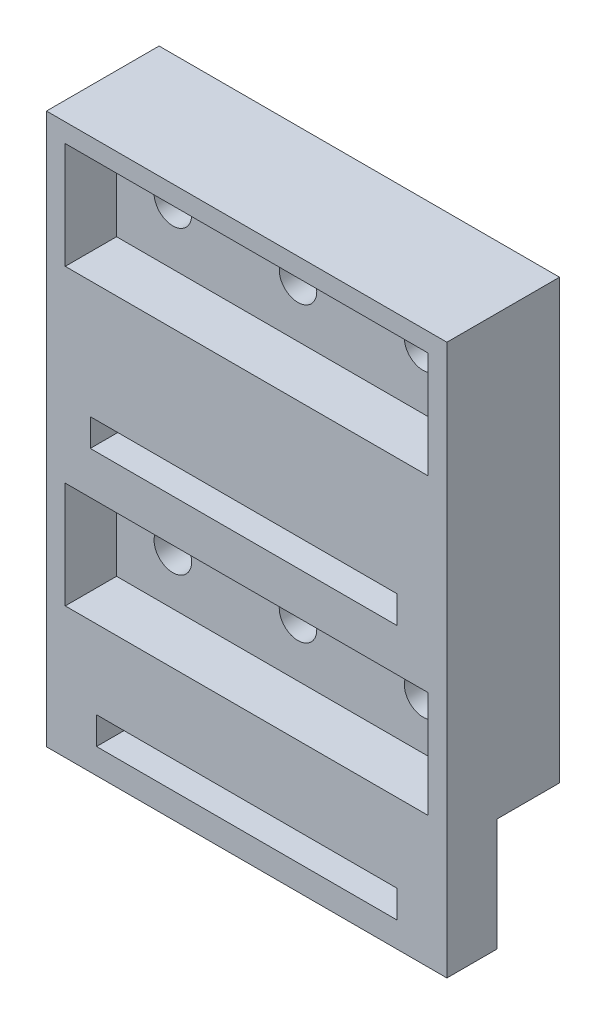
ISO-10303-21;
HEADER;
FILE_DESCRIPTION(('STEP AP214'),'2;1');
FILE_NAME('part.step','',(''),(''),'','','');
FILE_SCHEMA(('AUTOMOTIVE_DESIGN { 1 0 10303 214 1 1 1 1 }'));
ENDSEC;
DATA;
#1=APPLICATION_CONTEXT('core data for automotive mechanical design processes');
#2=APPLICATION_PROTOCOL_DEFINITION('international standard','automotive_design',2000,#1);
#3=PRODUCT_CONTEXT('',#1,'mechanical');
#4=PRODUCT('Part','Part','',(#3));
#5=PRODUCT_RELATED_PRODUCT_CATEGORY('part','',(#4));
#6=PRODUCT_DEFINITION_FORMATION('','',#4);
#7=PRODUCT_DEFINITION_CONTEXT('part definition',#1,'design');
#8=PRODUCT_DEFINITION('design','',#6,#7);
#9=PRODUCT_DEFINITION_SHAPE('','',#8);
#10=(LENGTH_UNIT() NAMED_UNIT(*) SI_UNIT(.MILLI.,.METRE.));
#11=(NAMED_UNIT(*) PLANE_ANGLE_UNIT() SI_UNIT($,.RADIAN.));
#12=(NAMED_UNIT(*) SI_UNIT($,.STERADIAN.) SOLID_ANGLE_UNIT());
#13=UNCERTAINTY_MEASURE_WITH_UNIT(LENGTH_MEASURE(1.E-05),#10,'distance_accuracy_value','');
#14=(GEOMETRIC_REPRESENTATION_CONTEXT(3) GLOBAL_UNCERTAINTY_ASSIGNED_CONTEXT((#13)) GLOBAL_UNIT_ASSIGNED_CONTEXT((#10,
#11,#12)) REPRESENTATION_CONTEXT('',''));
#15=CARTESIAN_POINT('',(0.,0.,0.));
#16=DIRECTION('',(0.,0.,1.));
#17=DIRECTION('',(1.,0.,0.));
#18=AXIS2_PLACEMENT_3D('',#15,#16,#17);
#19=CARTESIAN_POINT('',(-16.,-17.5,9.));
#20=DIRECTION('',(0.,1.,0.));
#21=DIRECTION('',(0.,0.,1.));
#22=AXIS2_PLACEMENT_3D('',#19,#20,#21);
#23=PLANE('',#22);
#24=DIRECTION('',(1.,0.,0.));
#25=VECTOR('',#24,1.);
#26=CARTESIAN_POINT('',(16.,-17.5,5.));
#27=LINE('',#26,#25);
#28=CARTESIAN_POINT('',(-16.,-17.5,5.));
#29=VERTEX_POINT('',#28);
#30=CARTESIAN_POINT('',(16.,-17.5,5.));
#31=VERTEX_POINT('',#30);
#32=EDGE_CURVE('E246',#29,#31,#27,.T.);
#33=ORIENTED_EDGE('',*,*,#32,.F.);
#34=DIRECTION('',(0.,0.,-1.));
#35=VECTOR('',#34,1.);
#36=CARTESIAN_POINT('',(-16.,-17.5,9.));
#37=LINE('',#36,#35);
#38=CARTESIAN_POINT('',(-16.,-17.5,0.));
#39=VERTEX_POINT('',#38);
#40=EDGE_CURVE('E429',#29,#39,#37,.T.);
#41=ORIENTED_EDGE('',*,*,#40,.T.);
#42=DIRECTION('',(1.,0.,0.));
#43=VECTOR('',#42,1.);
#44=CARTESIAN_POINT('',(-16.,-17.5,0.));
#45=LINE('',#44,#43);
#46=CARTESIAN_POINT('',(16.,-17.5,0.));
#47=VERTEX_POINT('',#46);
#48=EDGE_CURVE('E416',#39,#47,#45,.T.);
#49=ORIENTED_EDGE('',*,*,#48,.T.);
#50=DIRECTION('',(0.,0.,-1.));
#51=VECTOR('',#50,1.);
#52=CARTESIAN_POINT('',(16.,-17.5,9.));
#53=LINE('',#52,#51);
#54=EDGE_CURVE('E427',#31,#47,#53,.T.);
#55=ORIENTED_EDGE('',*,*,#54,.F.);
#56=EDGE_LOOP('',(#33,#41,#49,#55));
#57=FACE_BOUND('',#56,.T.);
#58=ADVANCED_FACE('F47',(#57),#23,.F.);
#59=CARTESIAN_POINT('',(-14.5,17.5,9.));
#60=DIRECTION('',(1.,0.,0.));
#61=DIRECTION('',(0.,1.,0.));
#62=AXIS2_PLACEMENT_3D('',#59,#60,#61);
#63=PLANE('',#62);
#64=DIRECTION('',(0.,-1.,0.));
#65=VECTOR('',#64,1.);
#66=CARTESIAN_POINT('',(-14.5,17.5,9.));
#67=LINE('',#66,#65);
#68=CARTESIAN_POINT('',(-14.5,16.,9.));
#69=VERTEX_POINT('',#68);
#70=CARTESIAN_POINT('',(-14.5,7.5,9.));
#71=VERTEX_POINT('',#70);
#72=EDGE_CURVE('E398',#69,#71,#67,.T.);
#73=ORIENTED_EDGE('',*,*,#72,.T.);
#74=DIRECTION('',(0.,0.,1.));
#75=VECTOR('',#74,1.);
#76=CARTESIAN_POINT('',(-14.5,7.5,9.));
#77=LINE('',#76,#75);
#78=CARTESIAN_POINT('',(-14.5,7.5,4.9));
#79=VERTEX_POINT('',#78);
#80=EDGE_CURVE('E313',#71,#79,#77,.F.);
#81=ORIENTED_EDGE('',*,*,#80,.T.);
#82=DIRECTION('',(0.,-1.,0.));
#83=VECTOR('',#82,1.);
#84=CARTESIAN_POINT('',(-14.5,17.5,4.9));
#85=LINE('',#84,#83);
#86=CARTESIAN_POINT('',(-14.5,16.,4.9));
#87=VERTEX_POINT('',#86);
#88=EDGE_CURVE('E372',#87,#79,#85,.T.);
#89=ORIENTED_EDGE('',*,*,#88,.F.);
#90=DIRECTION('',(0.,0.,-1.));
#91=VECTOR('',#90,1.);
#92=CARTESIAN_POINT('',(-14.5,16.,9.));
#93=LINE('',#92,#91);
#94=EDGE_CURVE('E381',#69,#87,#93,.T.);
#95=ORIENTED_EDGE('',*,*,#94,.F.);
#96=EDGE_LOOP('',(#73,#81,#89,#95));
#97=FACE_BOUND('',#96,.T.);
#98=ADVANCED_FACE('F467',(#97),#63,.T.);
#99=CARTESIAN_POINT('',(14.5,17.5,9.));
#100=DIRECTION('',(-1.,0.,0.));
#101=DIRECTION('',(0.,-1.,0.));
#102=AXIS2_PLACEMENT_3D('',#99,#100,#101);
#103=PLANE('',#102);
#104=DIRECTION('',(0.,1.,0.));
#105=VECTOR('',#104,1.);
#106=CARTESIAN_POINT('',(14.5,17.5,4.9));
#107=LINE('',#106,#105);
#108=CARTESIAN_POINT('',(14.5,7.5,4.9));
#109=VERTEX_POINT('',#108);
#110=CARTESIAN_POINT('',(14.5,16.,4.9));
#111=VERTEX_POINT('',#110);
#112=EDGE_CURVE('E387',#109,#111,#107,.T.);
#113=ORIENTED_EDGE('',*,*,#112,.F.);
#114=DIRECTION('',(0.,0.,1.));
#115=VECTOR('',#114,1.);
#116=CARTESIAN_POINT('',(14.5,7.5,9.));
#117=LINE('',#116,#115);
#118=CARTESIAN_POINT('',(14.5,7.5,9.));
#119=VERTEX_POINT('',#118);
#120=EDGE_CURVE('E330',#119,#109,#117,.F.);
#121=ORIENTED_EDGE('',*,*,#120,.F.);
#122=DIRECTION('',(0.,1.,0.));
#123=VECTOR('',#122,1.);
#124=CARTESIAN_POINT('',(14.5,17.5,9.));
#125=LINE('',#124,#123);
#126=CARTESIAN_POINT('',(14.5,16.,9.));
#127=VERTEX_POINT('',#126);
#128=EDGE_CURVE('E402',#119,#127,#125,.T.);
#129=ORIENTED_EDGE('',*,*,#128,.T.);
#130=DIRECTION('',(0.,0.,-1.));
#131=VECTOR('',#130,1.);
#132=CARTESIAN_POINT('',(14.5,16.,9.));
#133=LINE('',#132,#131);
#134=EDGE_CURVE('E384',#127,#111,#133,.T.);
#135=ORIENTED_EDGE('',*,*,#134,.T.);
#136=EDGE_LOOP('',(#113,#121,#129,#135));
#137=FACE_BOUND('',#136,.T.);
#138=ADVANCED_FACE('F472',(#137),#103,.T.);
#139=CARTESIAN_POINT('',(0.,0.,4.9));
#140=DIRECTION('',(0.,0.,1.));
#141=DIRECTION('',(1.,0.,0.));
#142=AXIS2_PLACEMENT_3D('',#139,#140,#141);
#143=PLANE('',#142);
#144=CARTESIAN_POINT('',(10.,12.,4.9));
#145=DIRECTION('',(0.,0.,1.));
#146=DIRECTION('',(-1.,0.,0.));
#147=AXIS2_PLACEMENT_3D('',#144,#145,#146);
#148=CIRCLE('',#147,1.5);
#149=CARTESIAN_POINT('',(8.5,12.,4.9));
#150=VERTEX_POINT('',#149);
#151=EDGE_CURVE('E329',#150,#150,#148,.T.);
#152=ORIENTED_EDGE('',*,*,#151,.F.);
#153=EDGE_LOOP('',(#152));
#154=FACE_BOUND('',#153,.T.);
#155=CARTESIAN_POINT('',(0.,11.7,4.9));
#156=DIRECTION('',(0.,0.,1.));
#157=DIRECTION('',(1.,0.,0.));
#158=AXIS2_PLACEMENT_3D('',#155,#156,#157);
#159=CIRCLE('',#158,1.5);
#160=CARTESIAN_POINT('',(1.5,11.7,4.9));
#161=VERTEX_POINT('',#160);
#162=EDGE_CURVE('E342',#161,#161,#159,.T.);
#163=ORIENTED_EDGE('',*,*,#162,.F.);
#164=EDGE_LOOP('',(#163));
#165=FACE_BOUND('',#164,.T.);
#166=CARTESIAN_POINT('',(-10.,12.,4.9));
#167=DIRECTION('',(0.,0.,1.));
#168=DIRECTION('',(-1.,0.,0.));
#169=AXIS2_PLACEMENT_3D('',#166,#167,#168);
#170=CIRCLE('',#169,1.5);
#171=CARTESIAN_POINT('',(-11.5,12.,4.9));
#172=VERTEX_POINT('',#171);
#173=EDGE_CURVE('E338',#172,#172,#170,.T.);
#174=ORIENTED_EDGE('',*,*,#173,.F.);
#175=EDGE_LOOP('',(#174));
#176=FACE_BOUND('',#175,.T.);
#177=ORIENTED_EDGE('',*,*,#88,.T.);
#178=DIRECTION('',(1.,0.,0.));
#179=VECTOR('',#178,1.);
#180=CARTESIAN_POINT('',(0.,7.5,4.9));
#181=LINE('',#180,#179);
#182=EDGE_CURVE('E431',#79,#109,#181,.T.);
#183=ORIENTED_EDGE('',*,*,#182,.T.);
#184=ORIENTED_EDGE('',*,*,#112,.T.);
#185=DIRECTION('',(-1.,0.,0.));
#186=VECTOR('',#185,1.);
#187=CARTESIAN_POINT('',(-16.,16.,4.9));
#188=LINE('',#187,#186);
#189=EDGE_CURVE('E393',#111,#87,#188,.T.);
#190=ORIENTED_EDGE('',*,*,#189,.T.);
#191=EDGE_LOOP('',(#177,#183,#184,#190));
#192=FACE_BOUND('',#191,.T.);
#193=ADVANCED_FACE('F497',(#154,#165,#176,#192),#143,.T.);
#194=CARTESIAN_POINT('',(-16.,17.5,9.));
#195=DIRECTION('',(1.,0.,0.));
#196=DIRECTION('',(0.,1.,0.));
#197=AXIS2_PLACEMENT_3D('',#194,#195,#196);
#198=PLANE('',#197);
#199=ORIENTED_EDGE('',*,*,#40,.F.);
#200=DIRECTION('',(0.,1.,0.));
#201=VECTOR('',#200,1.);
#202=CARTESIAN_POINT('',(-16.,-26.5,4.99999999999999));
#203=LINE('',#202,#201);
#204=CARTESIAN_POINT('',(-16.,-26.5,4.99999999999999));
#205=VERTEX_POINT('',#204);
#206=EDGE_CURVE('E264',#205,#29,#203,.T.);
#207=ORIENTED_EDGE('',*,*,#206,.F.);
#208=DIRECTION('',(0.,0.,-1.));
#209=VECTOR('',#208,1.);
#210=CARTESIAN_POINT('',(-16.,-26.5,9.));
#211=LINE('',#210,#209);
#212=CARTESIAN_POINT('',(-16.,-26.5,9.));
#213=VERTEX_POINT('',#212);
#214=EDGE_CURVE('E255',#213,#205,#211,.T.);
#215=ORIENTED_EDGE('',*,*,#214,.F.);
#216=DIRECTION('',(0.,-1.,0.));
#217=VECTOR('',#216,1.);
#218=CARTESIAN_POINT('',(-16.,17.5,9.));
#219=LINE('',#218,#217);
#220=CARTESIAN_POINT('',(-16.,17.5,9.));
#221=VERTEX_POINT('',#220);
#222=EDGE_CURVE('E406',#221,#213,#219,.T.);
#223=ORIENTED_EDGE('',*,*,#222,.F.);
#224=DIRECTION('',(0.,0.,-1.));
#225=VECTOR('',#224,1.);
#226=CARTESIAN_POINT('',(-16.,17.5,9.));
#227=LINE('',#226,#225);
#228=CARTESIAN_POINT('',(-16.,17.5,0.));
#229=VERTEX_POINT('',#228);
#230=EDGE_CURVE('E413',#221,#229,#227,.T.);
#231=ORIENTED_EDGE('',*,*,#230,.T.);
#232=DIRECTION('',(0.,-1.,0.));
#233=VECTOR('',#232,1.);
#234=CARTESIAN_POINT('',(-16.,17.5,0.));
#235=LINE('',#234,#233);
#236=EDGE_CURVE('E379',#229,#39,#235,.T.);
#237=ORIENTED_EDGE('',*,*,#236,.T.);
#238=EDGE_LOOP('',(#199,#207,#215,#223,#231,#237));
#239=FACE_BOUND('',#238,.T.);
#240=ADVANCED_FACE('F49',(#239),#198,.F.);
#241=CARTESIAN_POINT('',(16.,17.5,9.));
#242=DIRECTION('',(-1.,0.,0.));
#243=DIRECTION('',(0.,-1.,0.));
#244=AXIS2_PLACEMENT_3D('',#241,#242,#243);
#245=PLANE('',#244);
#246=DIRECTION('',(0.,0.,-1.));
#247=VECTOR('',#246,1.);
#248=CARTESIAN_POINT('',(16.,17.5,9.));
#249=LINE('',#248,#247);
#250=CARTESIAN_POINT('',(16.,17.5,9.));
#251=VERTEX_POINT('',#250);
#252=CARTESIAN_POINT('',(16.,17.5,0.));
#253=VERTEX_POINT('',#252);
#254=EDGE_CURVE('E424',#251,#253,#249,.T.);
#255=ORIENTED_EDGE('',*,*,#254,.F.);
#256=DIRECTION('',(0.,1.,0.));
#257=VECTOR('',#256,1.);
#258=CARTESIAN_POINT('',(16.,17.5,9.));
#259=LINE('',#258,#257);
#260=CARTESIAN_POINT('',(16.,-26.5,9.));
#261=VERTEX_POINT('',#260);
#262=EDGE_CURVE('E408',#261,#251,#259,.T.);
#263=ORIENTED_EDGE('',*,*,#262,.F.);
#264=DIRECTION('',(0.,0.,1.));
#265=VECTOR('',#264,1.);
#266=CARTESIAN_POINT('',(16.,-26.5,9.));
#267=LINE('',#266,#265);
#268=CARTESIAN_POINT('',(16.,-26.5,5.));
#269=VERTEX_POINT('',#268);
#270=EDGE_CURVE('E249',#269,#261,#267,.T.);
#271=ORIENTED_EDGE('',*,*,#270,.F.);
#272=DIRECTION('',(0.,1.,0.));
#273=VECTOR('',#272,1.);
#274=CARTESIAN_POINT('',(16.,-26.5,5.));
#275=LINE('',#274,#273);
#276=EDGE_CURVE('E259',#269,#31,#275,.T.);
#277=ORIENTED_EDGE('',*,*,#276,.T.);
#278=ORIENTED_EDGE('',*,*,#54,.T.);
#279=DIRECTION('',(0.,1.,0.));
#280=VECTOR('',#279,1.);
#281=CARTESIAN_POINT('',(16.,17.5,0.));
#282=LINE('',#281,#280);
#283=EDGE_CURVE('E419',#47,#253,#282,.T.);
#284=ORIENTED_EDGE('',*,*,#283,.T.);
#285=EDGE_LOOP('',(#255,#263,#271,#277,#278,#284));
#286=FACE_BOUND('',#285,.T.);
#287=ADVANCED_FACE('F477',(#286),#245,.F.);
#288=CARTESIAN_POINT('',(-16.,17.5,9.));
#289=DIRECTION('',(0.,-1.,0.));
#290=DIRECTION('',(0.,0.,-1.));
#291=AXIS2_PLACEMENT_3D('',#288,#289,#290);
#292=PLANE('',#291);
#293=DIRECTION('',(-1.,0.,0.));
#294=VECTOR('',#293,1.);
#295=CARTESIAN_POINT('',(-16.,17.5,0.));
#296=LINE('',#295,#294);
#297=EDGE_CURVE('E409',#253,#229,#296,.T.);
#298=ORIENTED_EDGE('',*,*,#297,.T.);
#299=ORIENTED_EDGE('',*,*,#230,.F.);
#300=DIRECTION('',(-1.,0.,0.));
#301=VECTOR('',#300,1.);
#302=CARTESIAN_POINT('',(-16.,17.5,9.));
#303=LINE('',#302,#301);
#304=EDGE_CURVE('E411',#251,#221,#303,.T.);
#305=ORIENTED_EDGE('',*,*,#304,.F.);
#306=ORIENTED_EDGE('',*,*,#254,.T.);
#307=EDGE_LOOP('',(#298,#299,#305,#306));
#308=FACE_BOUND('',#307,.T.);
#309=ADVANCED_FACE('F480',(#308),#292,.F.);
#310=CARTESIAN_POINT('',(0.,0.,9.));
#311=DIRECTION('',(0.,0.,1.));
#312=DIRECTION('',(1.,0.,0.));
#313=AXIS2_PLACEMENT_3D('',#310,#311,#312);
#314=PLANE('',#313);
#315=DIRECTION('',(0.,1.,0.));
#316=VECTOR('',#315,1.);
#317=CARTESIAN_POINT('',(12.,-24.48,9.));
#318=LINE('',#317,#316);
#319=CARTESIAN_POINT('',(12.,-24.48,9.));
#320=VERTEX_POINT('',#319);
#321=CARTESIAN_POINT('',(12.,-22.28,9.));
#322=VERTEX_POINT('',#321);
#323=EDGE_CURVE('E62',#320,#322,#318,.T.);
#324=ORIENTED_EDGE('',*,*,#323,.F.);
#325=DIRECTION('',(1.,0.,0.));
#326=VECTOR('',#325,1.);
#327=CARTESIAN_POINT('',(12.,-24.48,9.));
#328=LINE('',#327,#326);
#329=CARTESIAN_POINT('',(-12.,-24.48,9.));
#330=VERTEX_POINT('',#329);
#331=EDGE_CURVE('E239',#330,#320,#328,.T.);
#332=ORIENTED_EDGE('',*,*,#331,.F.);
#333=DIRECTION('',(0.,-1.,0.));
#334=VECTOR('',#333,1.);
#335=CARTESIAN_POINT('',(-12.,-24.48,9.));
#336=LINE('',#335,#334);
#337=CARTESIAN_POINT('',(-12.,-22.28,9.));
#338=VERTEX_POINT('',#337);
#339=EDGE_CURVE('E223',#338,#330,#336,.T.);
#340=ORIENTED_EDGE('',*,*,#339,.F.);
#341=DIRECTION('',(-1.,0.,0.));
#342=VECTOR('',#341,1.);
#343=CARTESIAN_POINT('',(12.,-22.28,9.));
#344=LINE('',#343,#342);
#345=EDGE_CURVE('E232',#322,#338,#344,.T.);
#346=ORIENTED_EDGE('',*,*,#345,.F.);
#347=EDGE_LOOP('',(#324,#332,#340,#346));
#348=FACE_BOUND('',#347,.T.);
#349=DIRECTION('',(0.,-1.,0.));
#350=VECTOR('',#349,1.);
#351=CARTESIAN_POINT('',(-12.5,0.,9.));
#352=LINE('',#351,#350);
#353=CARTESIAN_POINT('',(-12.5,-1.9,9.));
#354=VERTEX_POINT('',#353);
#355=CARTESIAN_POINT('',(-12.5,-4.1,9.));
#356=VERTEX_POINT('',#355);
#357=EDGE_CURVE('E443',#354,#356,#352,.T.);
#358=ORIENTED_EDGE('',*,*,#357,.F.);
#359=DIRECTION('',(-1.,0.,0.));
#360=VECTOR('',#359,1.);
#361=CARTESIAN_POINT('',(0.,-1.9,9.));
#362=LINE('',#361,#360);
#363=CARTESIAN_POINT('',(12.,-1.9,9.));
#364=VERTEX_POINT('',#363);
#365=EDGE_CURVE('E435',#364,#354,#362,.T.);
#366=ORIENTED_EDGE('',*,*,#365,.F.);
#367=DIRECTION('',(0.,1.,0.));
#368=VECTOR('',#367,1.);
#369=CARTESIAN_POINT('',(12.,0.,9.));
#370=LINE('',#369,#368);
#371=CARTESIAN_POINT('',(12.,-4.1,9.));
#372=VERTEX_POINT('',#371);
#373=EDGE_CURVE('E438',#372,#364,#370,.T.);
#374=ORIENTED_EDGE('',*,*,#373,.F.);
#375=DIRECTION('',(1.,0.,0.));
#376=VECTOR('',#375,1.);
#377=CARTESIAN_POINT('',(0.,-4.1,9.));
#378=LINE('',#377,#376);
#379=EDGE_CURVE('E441',#356,#372,#378,.T.);
#380=ORIENTED_EDGE('',*,*,#379,.F.);
#381=EDGE_LOOP('',(#358,#366,#374,#380));
#382=FACE_BOUND('',#381,.T.);
#383=CARTESIAN_POINT('',(-14.5,-7.5,9.));
#384=VERTEX_POINT('',#383);
#385=CARTESIAN_POINT('',(-14.5,-16.,9.));
#386=VERTEX_POINT('',#385);
#387=EDGE_CURVE('E397',#384,#386,#67,.T.);
#388=ORIENTED_EDGE('',*,*,#387,.F.);
#389=DIRECTION('',(1.,0.,0.));
#390=VECTOR('',#389,1.);
#391=CARTESIAN_POINT('',(14.5,-7.5,9.));
#392=LINE('',#391,#390);
#393=CARTESIAN_POINT('',(14.5,-7.5,9.));
#394=VERTEX_POINT('',#393);
#395=EDGE_CURVE('E322',#394,#384,#392,.F.);
#396=ORIENTED_EDGE('',*,*,#395,.F.);
#397=CARTESIAN_POINT('',(14.5,-16.,9.));
#398=VERTEX_POINT('',#397);
#399=EDGE_CURVE('E403',#398,#394,#125,.T.);
#400=ORIENTED_EDGE('',*,*,#399,.F.);
#401=DIRECTION('',(1.,0.,0.));
#402=VECTOR('',#401,1.);
#403=CARTESIAN_POINT('',(-16.,-16.,9.));
#404=LINE('',#403,#402);
#405=EDGE_CURVE('E400',#386,#398,#404,.T.);
#406=ORIENTED_EDGE('',*,*,#405,.F.);
#407=EDGE_LOOP('',(#388,#396,#400,#406));
#408=FACE_BOUND('',#407,.T.);
#409=DIRECTION('',(1.,0.,0.));
#410=VECTOR('',#409,1.);
#411=CARTESIAN_POINT('',(14.5,7.5,9.));
#412=LINE('',#411,#410);
#413=EDGE_CURVE('E326',#119,#71,#412,.F.);
#414=ORIENTED_EDGE('',*,*,#413,.T.);
#415=ORIENTED_EDGE('',*,*,#72,.F.);
#416=DIRECTION('',(-1.,0.,0.));
#417=VECTOR('',#416,1.);
#418=CARTESIAN_POINT('',(-16.,16.,9.));
#419=LINE('',#418,#417);
#420=EDGE_CURVE('E385',#127,#69,#419,.T.);
#421=ORIENTED_EDGE('',*,*,#420,.F.);
#422=ORIENTED_EDGE('',*,*,#128,.F.);
#423=EDGE_LOOP('',(#414,#415,#421,#422));
#424=FACE_BOUND('',#423,.T.);
#425=ORIENTED_EDGE('',*,*,#262,.T.);
#426=ORIENTED_EDGE('',*,*,#304,.T.);
#427=ORIENTED_EDGE('',*,*,#222,.T.);
#428=DIRECTION('',(-1.,0.,0.));
#429=VECTOR('',#428,1.);
#430=CARTESIAN_POINT('',(16.,-26.5,9.));
#431=LINE('',#430,#429);
#432=EDGE_CURVE('E252',#261,#213,#431,.T.);
#433=ORIENTED_EDGE('',*,*,#432,.F.);
#434=EDGE_LOOP('',(#425,#426,#427,#433));
#435=FACE_BOUND('',#434,.T.);
#436=ADVANCED_FACE('F236',(#348,#382,#408,#424,#435),#314,.T.);
#437=CARTESIAN_POINT('',(0.,0.,0.));
#438=DIRECTION('',(0.,0.,1.));
#439=DIRECTION('',(1.,0.,0.));
#440=AXIS2_PLACEMENT_3D('',#437,#438,#439);
#441=PLANE('',#440);
#442=DIRECTION('',(1.,0.,0.));
#443=VECTOR('',#442,1.);
#444=CARTESIAN_POINT('',(-14.,1.,0.));
#445=LINE('',#444,#443);
#446=CARTESIAN_POINT('',(-14.,1.,0.));
#447=VERTEX_POINT('',#446);
#448=CARTESIAN_POINT('',(14.,1.,0.));
#449=VERTEX_POINT('',#448);
#450=EDGE_CURVE('E303',#447,#449,#445,.T.);
#451=ORIENTED_EDGE('',*,*,#450,.F.);
#452=DIRECTION('',(0.,1.,0.));
#453=VECTOR('',#452,1.);
#454=CARTESIAN_POINT('',(-14.,-7.,0.));
#455=LINE('',#454,#453);
#456=CARTESIAN_POINT('',(-14.,-7.,0.));
#457=VERTEX_POINT('',#456);
#458=EDGE_CURVE('E281',#457,#447,#455,.T.);
#459=ORIENTED_EDGE('',*,*,#458,.F.);
#460=DIRECTION('',(-1.,0.,0.));
#461=VECTOR('',#460,1.);
#462=CARTESIAN_POINT('',(-14.,-7.,0.));
#463=LINE('',#462,#461);
#464=CARTESIAN_POINT('',(14.,-7.,0.));
#465=VERTEX_POINT('',#464);
#466=EDGE_CURVE('E292',#465,#457,#463,.T.);
#467=ORIENTED_EDGE('',*,*,#466,.F.);
#468=DIRECTION('',(0.,-1.,0.));
#469=VECTOR('',#468,1.);
#470=CARTESIAN_POINT('',(14.,-7.,0.));
#471=LINE('',#470,#469);
#472=EDGE_CURVE('E306',#449,#465,#471,.T.);
#473=ORIENTED_EDGE('',*,*,#472,.F.);
#474=EDGE_LOOP('',(#451,#459,#467,#473));
#475=FACE_BOUND('',#474,.T.);
#476=ORIENTED_EDGE('',*,*,#297,.F.);
#477=ORIENTED_EDGE('',*,*,#283,.F.);
#478=ORIENTED_EDGE('',*,*,#48,.F.);
#479=ORIENTED_EDGE('',*,*,#236,.F.);
#480=EDGE_LOOP('',(#476,#477,#478,#479));
#481=FACE_BOUND('',#480,.T.);
#482=CARTESIAN_POINT('',(-10.,12.,0.));
#483=DIRECTION('',(0.,0.,1.));
#484=DIRECTION('',(1.,0.,0.));
#485=AXIS2_PLACEMENT_3D('',#482,#483,#484);
#486=CIRCLE('',#485,1.5);
#487=CARTESIAN_POINT('',(-8.5,12.,0.));
#488=VERTEX_POINT('',#487);
#489=EDGE_CURVE('E368',#488,#488,#486,.T.);
#490=ORIENTED_EDGE('',*,*,#489,.T.);
#491=EDGE_LOOP('',(#490));
#492=FACE_BOUND('',#491,.T.);
#493=CARTESIAN_POINT('',(0.,11.7,0.));
#494=DIRECTION('',(0.,0.,1.));
#495=DIRECTION('',(1.,0.,0.));
#496=AXIS2_PLACEMENT_3D('',#493,#494,#495);
#497=CIRCLE('',#496,1.5);
#498=CARTESIAN_POINT('',(1.5,11.7,0.));
#499=VERTEX_POINT('',#498);
#500=EDGE_CURVE('E362',#499,#499,#497,.T.);
#501=ORIENTED_EDGE('',*,*,#500,.T.);
#502=EDGE_LOOP('',(#501));
#503=FACE_BOUND('',#502,.T.);
#504=CARTESIAN_POINT('',(10.,12.,0.));
#505=DIRECTION('',(0.,0.,1.));
#506=DIRECTION('',(1.,0.,0.));
#507=AXIS2_PLACEMENT_3D('',#504,#505,#506);
#508=CIRCLE('',#507,1.5);
#509=CARTESIAN_POINT('',(11.5,12.,0.));
#510=VERTEX_POINT('',#509);
#511=EDGE_CURVE('E356',#510,#510,#508,.T.);
#512=ORIENTED_EDGE('',*,*,#511,.T.);
#513=EDGE_LOOP('',(#512));
#514=FACE_BOUND('',#513,.T.);
#515=CARTESIAN_POINT('',(0.,-11.7,0.));
#516=DIRECTION('',(0.,0.,1.));
#517=DIRECTION('',(1.,0.,0.));
#518=AXIS2_PLACEMENT_3D('',#515,#516,#517);
#519=CIRCLE('',#518,1.5);
#520=CARTESIAN_POINT('',(1.5,-11.7,0.));
#521=VERTEX_POINT('',#520);
#522=EDGE_CURVE('E365',#521,#521,#519,.T.);
#523=ORIENTED_EDGE('',*,*,#522,.T.);
#524=EDGE_LOOP('',(#523));
#525=FACE_BOUND('',#524,.T.);
#526=CARTESIAN_POINT('',(10.,-12.,0.));
#527=DIRECTION('',(0.,0.,1.));
#528=DIRECTION('',(1.,0.,0.));
#529=AXIS2_PLACEMENT_3D('',#526,#527,#528);
#530=CIRCLE('',#529,1.5);
#531=CARTESIAN_POINT('',(11.5,-12.,0.));
#532=VERTEX_POINT('',#531);
#533=EDGE_CURVE('E359',#532,#532,#530,.T.);
#534=ORIENTED_EDGE('',*,*,#533,.T.);
#535=EDGE_LOOP('',(#534));
#536=FACE_BOUND('',#535,.T.);
#537=CARTESIAN_POINT('',(-10.,-12.,0.));
#538=DIRECTION('',(0.,0.,1.));
#539=DIRECTION('',(1.,0.,0.));
#540=AXIS2_PLACEMENT_3D('',#537,#538,#539);
#541=CIRCLE('',#540,1.5);
#542=CARTESIAN_POINT('',(-8.5,-12.,0.));
#543=VERTEX_POINT('',#542);
#544=EDGE_CURVE('E353',#543,#543,#541,.T.);
#545=ORIENTED_EDGE('',*,*,#544,.T.);
#546=EDGE_LOOP('',(#545));
#547=FACE_BOUND('',#546,.T.);
#548=ADVANCED_FACE('F485',(#475,#481,#492,#503,#514,#525,#536,#547),#441,.F.);
#549=DIRECTION('',(0.,0.,1.));
#550=VECTOR('',#549,1.);
#551=CARTESIAN_POINT('',(-14.5,-7.5,9.));
#552=LINE('',#551,#550);
#553=CARTESIAN_POINT('',(-14.5,-7.5,4.9));
#554=VERTEX_POINT('',#553);
#555=EDGE_CURVE('E323',#384,#554,#552,.F.);
#556=ORIENTED_EDGE('',*,*,#555,.F.);
#557=ORIENTED_EDGE('',*,*,#387,.T.);
#558=DIRECTION('',(0.,0.,-1.));
#559=VECTOR('',#558,1.);
#560=CARTESIAN_POINT('',(-14.5,-16.,9.));
#561=LINE('',#560,#559);
#562=CARTESIAN_POINT('',(-14.5,-16.,4.9));
#563=VERTEX_POINT('',#562);
#564=EDGE_CURVE('E376',#386,#563,#561,.T.);
#565=ORIENTED_EDGE('',*,*,#564,.T.);
#566=EDGE_CURVE('E371',#554,#563,#85,.T.);
#567=ORIENTED_EDGE('',*,*,#566,.F.);
#568=EDGE_LOOP('',(#556,#557,#565,#567));
#569=FACE_BOUND('',#568,.T.);
#570=ADVANCED_FACE('F475',(#569),#63,.T.);
#571=CARTESIAN_POINT('',(-16.,-16.,9.));
#572=DIRECTION('',(0.,1.,0.));
#573=DIRECTION('',(0.,0.,1.));
#574=AXIS2_PLACEMENT_3D('',#571,#572,#573);
#575=PLANE('',#574);
#576=DIRECTION('',(1.,0.,0.));
#577=VECTOR('',#576,1.);
#578=CARTESIAN_POINT('',(-16.,-16.,4.9));
#579=LINE('',#578,#577);
#580=CARTESIAN_POINT('',(14.5,-16.,4.9));
#581=VERTEX_POINT('',#580);
#582=EDGE_CURVE('E375',#563,#581,#579,.T.);
#583=ORIENTED_EDGE('',*,*,#582,.F.);
#584=ORIENTED_EDGE('',*,*,#564,.F.);
#585=ORIENTED_EDGE('',*,*,#405,.T.);
#586=DIRECTION('',(0.,0.,-1.));
#587=VECTOR('',#586,1.);
#588=CARTESIAN_POINT('',(14.5,-16.,9.));
#589=LINE('',#588,#587);
#590=EDGE_CURVE('E380',#398,#581,#589,.T.);
#591=ORIENTED_EDGE('',*,*,#590,.T.);
#592=EDGE_LOOP('',(#583,#584,#585,#591));
#593=FACE_BOUND('',#592,.T.);
#594=ADVANCED_FACE('F504',(#593),#575,.T.);
#595=DIRECTION('',(0.,0.,1.));
#596=VECTOR('',#595,1.);
#597=CARTESIAN_POINT('',(14.5,-7.5,9.));
#598=LINE('',#597,#596);
#599=CARTESIAN_POINT('',(14.5,-7.5,4.9));
#600=VERTEX_POINT('',#599);
#601=EDGE_CURVE('E320',#394,#600,#598,.F.);
#602=ORIENTED_EDGE('',*,*,#601,.T.);
#603=EDGE_CURVE('E390',#581,#600,#107,.T.);
#604=ORIENTED_EDGE('',*,*,#603,.F.);
#605=ORIENTED_EDGE('',*,*,#590,.F.);
#606=ORIENTED_EDGE('',*,*,#399,.T.);
#607=EDGE_LOOP('',(#602,#604,#605,#606));
#608=FACE_BOUND('',#607,.T.);
#609=ADVANCED_FACE('F500',(#608),#103,.T.);
#610=CARTESIAN_POINT('',(-16.,16.,9.));
#611=DIRECTION('',(0.,-1.,0.));
#612=DIRECTION('',(0.,0.,-1.));
#613=AXIS2_PLACEMENT_3D('',#610,#611,#612);
#614=PLANE('',#613);
#615=ORIENTED_EDGE('',*,*,#189,.F.);
#616=ORIENTED_EDGE('',*,*,#134,.F.);
#617=ORIENTED_EDGE('',*,*,#420,.T.);
#618=ORIENTED_EDGE('',*,*,#94,.T.);
#619=EDGE_LOOP('',(#615,#616,#617,#618));
#620=FACE_BOUND('',#619,.T.);
#621=ADVANCED_FACE('F495',(#620),#614,.T.);
#622=DIRECTION('',(1.,0.,0.));
#623=VECTOR('',#622,1.);
#624=CARTESIAN_POINT('',(0.,-7.5,4.9));
#625=LINE('',#624,#623);
#626=EDGE_CURVE('E432',#554,#600,#625,.T.);
#627=ORIENTED_EDGE('',*,*,#626,.F.);
#628=ORIENTED_EDGE('',*,*,#566,.T.);
#629=ORIENTED_EDGE('',*,*,#582,.T.);
#630=ORIENTED_EDGE('',*,*,#603,.T.);
#631=EDGE_LOOP('',(#627,#628,#629,#630));
#632=FACE_BOUND('',#631,.T.);
#633=CARTESIAN_POINT('',(0.,-11.7,4.9));
#634=DIRECTION('',(0.,0.,1.));
#635=DIRECTION('',(-1.,0.,0.));
#636=AXIS2_PLACEMENT_3D('',#633,#634,#635);
#637=CIRCLE('',#636,1.5);
#638=CARTESIAN_POINT('',(-1.5,-11.7,4.9));
#639=VERTEX_POINT('',#638);
#640=EDGE_CURVE('E339',#639,#639,#637,.T.);
#641=ORIENTED_EDGE('',*,*,#640,.F.);
#642=EDGE_LOOP('',(#641));
#643=FACE_BOUND('',#642,.T.);
#644=CARTESIAN_POINT('',(10.,-12.,4.9));
#645=DIRECTION('',(0.,0.,1.));
#646=DIRECTION('',(1.,0.,0.));
#647=AXIS2_PLACEMENT_3D('',#644,#645,#646);
#648=CIRCLE('',#647,1.5);
#649=CARTESIAN_POINT('',(11.5,-12.,4.9));
#650=VERTEX_POINT('',#649);
#651=EDGE_CURVE('E345',#650,#650,#648,.T.);
#652=ORIENTED_EDGE('',*,*,#651,.F.);
#653=EDGE_LOOP('',(#652));
#654=FACE_BOUND('',#653,.T.);
#655=CARTESIAN_POINT('',(-10.,-12.,4.9));
#656=DIRECTION('',(0.,0.,1.));
#657=DIRECTION('',(1.,0.,0.));
#658=AXIS2_PLACEMENT_3D('',#655,#656,#657);
#659=CIRCLE('',#658,1.5);
#660=CARTESIAN_POINT('',(-8.5,-12.,4.9));
#661=VERTEX_POINT('',#660);
#662=EDGE_CURVE('E348',#661,#661,#659,.T.);
#663=ORIENTED_EDGE('',*,*,#662,.F.);
#664=EDGE_LOOP('',(#663));
#665=FACE_BOUND('',#664,.T.);
#666=ADVANCED_FACE('F491',(#632,#643,#654,#665),#143,.T.);
#667=CARTESIAN_POINT('',(-10.,-12.,-4.1));
#668=DIRECTION('',(0.,0.,1.));
#669=DIRECTION('',(1.,0.,0.));
#670=AXIS2_PLACEMENT_3D('',#667,#668,#669);
#671=CYLINDRICAL_SURFACE('',#670,1.5);
#672=ORIENTED_EDGE('',*,*,#662,.T.);
#673=EDGE_LOOP('',(#672));
#674=FACE_BOUND('',#673,.T.);
#675=ORIENTED_EDGE('',*,*,#544,.F.);
#676=EDGE_LOOP('',(#675));
#677=FACE_BOUND('',#676,.T.);
#678=ADVANCED_FACE('F494',(#674,#677),#671,.F.);
#679=CARTESIAN_POINT('',(10.,12.,-4.1));
#680=DIRECTION('',(0.,0.,1.));
#681=DIRECTION('',(1.,0.,0.));
#682=AXIS2_PLACEMENT_3D('',#679,#680,#681);
#683=CYLINDRICAL_SURFACE('',#682,1.5);
#684=ORIENTED_EDGE('',*,*,#151,.T.);
#685=EDGE_LOOP('',(#684));
#686=FACE_BOUND('',#685,.T.);
#687=ORIENTED_EDGE('',*,*,#511,.F.);
#688=EDGE_LOOP('',(#687));
#689=FACE_BOUND('',#688,.T.);
#690=ADVANCED_FACE('F513',(#686,#689),#683,.F.);
#691=CARTESIAN_POINT('',(10.,-12.,-4.1));
#692=DIRECTION('',(0.,0.,1.));
#693=DIRECTION('',(1.,0.,0.));
#694=AXIS2_PLACEMENT_3D('',#691,#692,#693);
#695=CYLINDRICAL_SURFACE('',#694,1.5);
#696=ORIENTED_EDGE('',*,*,#651,.T.);
#697=EDGE_LOOP('',(#696));
#698=FACE_BOUND('',#697,.T.);
#699=ORIENTED_EDGE('',*,*,#533,.F.);
#700=EDGE_LOOP('',(#699));
#701=FACE_BOUND('',#700,.T.);
#702=ADVANCED_FACE('F519',(#698,#701),#695,.F.);
#703=CARTESIAN_POINT('',(0.,11.7,-4.1));
#704=DIRECTION('',(0.,0.,1.));
#705=DIRECTION('',(1.,0.,0.));
#706=AXIS2_PLACEMENT_3D('',#703,#704,#705);
#707=CYLINDRICAL_SURFACE('',#706,1.5);
#708=ORIENTED_EDGE('',*,*,#162,.T.);
#709=EDGE_LOOP('',(#708));
#710=FACE_BOUND('',#709,.T.);
#711=ORIENTED_EDGE('',*,*,#500,.F.);
#712=EDGE_LOOP('',(#711));
#713=FACE_BOUND('',#712,.T.);
#714=ADVANCED_FACE('F515',(#710,#713),#707,.F.);
#715=CARTESIAN_POINT('',(0.,-11.7,-4.1));
#716=DIRECTION('',(0.,0.,1.));
#717=DIRECTION('',(1.,0.,0.));
#718=AXIS2_PLACEMENT_3D('',#715,#716,#717);
#719=CYLINDRICAL_SURFACE('',#718,1.5);
#720=ORIENTED_EDGE('',*,*,#640,.T.);
#721=EDGE_LOOP('',(#720));
#722=FACE_BOUND('',#721,.T.);
#723=ORIENTED_EDGE('',*,*,#522,.F.);
#724=EDGE_LOOP('',(#723));
#725=FACE_BOUND('',#724,.T.);
#726=ADVANCED_FACE('F518',(#722,#725),#719,.F.);
#727=CARTESIAN_POINT('',(-10.,12.,-4.1));
#728=DIRECTION('',(0.,0.,1.));
#729=DIRECTION('',(1.,0.,0.));
#730=AXIS2_PLACEMENT_3D('',#727,#728,#729);
#731=CYLINDRICAL_SURFACE('',#730,1.5);
#732=ORIENTED_EDGE('',*,*,#173,.T.);
#733=EDGE_LOOP('',(#732));
#734=FACE_BOUND('',#733,.T.);
#735=ORIENTED_EDGE('',*,*,#489,.F.);
#736=EDGE_LOOP('',(#735));
#737=FACE_BOUND('',#736,.T.);
#738=ADVANCED_FACE('F524',(#734,#737),#731,.F.);
#739=CARTESIAN_POINT('',(14.5,-7.5,9.));
#740=DIRECTION('',(0.,-1.,0.));
#741=DIRECTION('',(1.,0.,0.));
#742=AXIS2_PLACEMENT_3D('',#739,#740,#741);
#743=PLANE('',#742);
#744=ORIENTED_EDGE('',*,*,#555,.T.);
#745=ORIENTED_EDGE('',*,*,#626,.T.);
#746=ORIENTED_EDGE('',*,*,#601,.F.);
#747=ORIENTED_EDGE('',*,*,#395,.T.);
#748=EDGE_LOOP('',(#744,#745,#746,#747));
#749=FACE_BOUND('',#748,.T.);
#750=ADVANCED_FACE('F527',(#749),#743,.T.);
#751=CARTESIAN_POINT('',(14.5,7.5,9.));
#752=DIRECTION('',(0.,-1.,0.));
#753=DIRECTION('',(1.,0.,0.));
#754=AXIS2_PLACEMENT_3D('',#751,#752,#753);
#755=PLANE('',#754);
#756=ORIENTED_EDGE('',*,*,#182,.F.);
#757=ORIENTED_EDGE('',*,*,#80,.F.);
#758=ORIENTED_EDGE('',*,*,#413,.F.);
#759=ORIENTED_EDGE('',*,*,#120,.T.);
#760=EDGE_LOOP('',(#756,#757,#758,#759));
#761=FACE_BOUND('',#760,.T.);
#762=ADVANCED_FACE('F535',(#761),#755,.F.);
#763=CARTESIAN_POINT('',(-14.,-7.,5.));
#764=DIRECTION('',(-1.,0.,0.));
#765=DIRECTION('',(0.,-1.,0.));
#766=AXIS2_PLACEMENT_3D('',#763,#764,#765);
#767=PLANE('',#766);
#768=ORIENTED_EDGE('',*,*,#458,.T.);
#769=DIRECTION('',(0.,0.,-1.));
#770=VECTOR('',#769,1.);
#771=CARTESIAN_POINT('',(-14.,1.,5.));
#772=LINE('',#771,#770);
#773=CARTESIAN_POINT('',(-14.,1.,5.));
#774=VERTEX_POINT('',#773);
#775=EDGE_CURVE('E301',#774,#447,#772,.T.);
#776=ORIENTED_EDGE('',*,*,#775,.F.);
#777=DIRECTION('',(0.,1.,0.));
#778=VECTOR('',#777,1.);
#779=CARTESIAN_POINT('',(-14.,-7.,5.));
#780=LINE('',#779,#778);
#781=CARTESIAN_POINT('',(-14.,-7.,5.));
#782=VERTEX_POINT('',#781);
#783=EDGE_CURVE('E288',#782,#774,#780,.T.);
#784=ORIENTED_EDGE('',*,*,#783,.F.);
#785=DIRECTION('',(0.,0.,-1.));
#786=VECTOR('',#785,1.);
#787=CARTESIAN_POINT('',(-14.,-7.,5.));
#788=LINE('',#787,#786);
#789=EDGE_CURVE('E311',#782,#457,#788,.T.);
#790=ORIENTED_EDGE('',*,*,#789,.T.);
#791=EDGE_LOOP('',(#768,#776,#784,#790));
#792=FACE_BOUND('',#791,.T.);
#793=ADVANCED_FACE('F538',(#792),#767,.F.);
#794=CARTESIAN_POINT('',(-14.,-7.,5.));
#795=DIRECTION('',(0.,-1.,0.));
#796=DIRECTION('',(1.,0.,0.));
#797=AXIS2_PLACEMENT_3D('',#794,#795,#796);
#798=PLANE('',#797);
#799=ORIENTED_EDGE('',*,*,#466,.T.);
#800=ORIENTED_EDGE('',*,*,#789,.F.);
#801=DIRECTION('',(-1.,0.,0.));
#802=VECTOR('',#801,1.);
#803=CARTESIAN_POINT('',(-14.,-7.,5.));
#804=LINE('',#803,#802);
#805=CARTESIAN_POINT('',(14.,-7.,5.));
#806=VERTEX_POINT('',#805);
#807=EDGE_CURVE('E298',#806,#782,#804,.T.);
#808=ORIENTED_EDGE('',*,*,#807,.F.);
#809=DIRECTION('',(0.,0.,-1.));
#810=VECTOR('',#809,1.);
#811=CARTESIAN_POINT('',(14.,-7.,5.));
#812=LINE('',#811,#810);
#813=EDGE_CURVE('E314',#806,#465,#812,.T.);
#814=ORIENTED_EDGE('',*,*,#813,.T.);
#815=EDGE_LOOP('',(#799,#800,#808,#814));
#816=FACE_BOUND('',#815,.T.);
#817=ADVANCED_FACE('F545',(#816),#798,.F.);
#818=CARTESIAN_POINT('',(14.,-7.,5.));
#819=DIRECTION('',(1.,0.,0.));
#820=DIRECTION('',(0.,1.,0.));
#821=AXIS2_PLACEMENT_3D('',#818,#819,#820);
#822=PLANE('',#821);
#823=ORIENTED_EDGE('',*,*,#472,.T.);
#824=ORIENTED_EDGE('',*,*,#813,.F.);
#825=DIRECTION('',(0.,-1.,0.));
#826=VECTOR('',#825,1.);
#827=CARTESIAN_POINT('',(14.,-7.,5.));
#828=LINE('',#827,#826);
#829=CARTESIAN_POINT('',(14.,1.,5.));
#830=VERTEX_POINT('',#829);
#831=EDGE_CURVE('E295',#830,#806,#828,.T.);
#832=ORIENTED_EDGE('',*,*,#831,.F.);
#833=DIRECTION('',(0.,0.,-1.));
#834=VECTOR('',#833,1.);
#835=CARTESIAN_POINT('',(14.,1.,5.));
#836=LINE('',#835,#834);
#837=EDGE_CURVE('E316',#830,#449,#836,.T.);
#838=ORIENTED_EDGE('',*,*,#837,.T.);
#839=EDGE_LOOP('',(#823,#824,#832,#838));
#840=FACE_BOUND('',#839,.T.);
#841=ADVANCED_FACE('F551',(#840),#822,.F.);
#842=CARTESIAN_POINT('',(-14.,1.,5.));
#843=DIRECTION('',(0.,1.,0.));
#844=DIRECTION('',(-1.,0.,0.));
#845=AXIS2_PLACEMENT_3D('',#842,#843,#844);
#846=PLANE('',#845);
#847=ORIENTED_EDGE('',*,*,#450,.T.);
#848=ORIENTED_EDGE('',*,*,#837,.F.);
#849=DIRECTION('',(1.,0.,0.));
#850=VECTOR('',#849,1.);
#851=CARTESIAN_POINT('',(-14.,1.,5.));
#852=LINE('',#851,#850);
#853=EDGE_CURVE('E291',#774,#830,#852,.T.);
#854=ORIENTED_EDGE('',*,*,#853,.F.);
#855=ORIENTED_EDGE('',*,*,#775,.T.);
#856=EDGE_LOOP('',(#847,#848,#854,#855));
#857=FACE_BOUND('',#856,.T.);
#858=ADVANCED_FACE('F547',(#857),#846,.F.);
#859=CARTESIAN_POINT('',(0.,0.,5.));
#860=DIRECTION('',(0.,0.,-1.));
#861=DIRECTION('',(-1.,0.,0.));
#862=AXIS2_PLACEMENT_3D('',#859,#860,#861);
#863=PLANE('',#862);
#864=DIRECTION('',(0.,1.,0.));
#865=VECTOR('',#864,1.);
#866=CARTESIAN_POINT('',(-12.5,-1.9,5.));
#867=LINE('',#866,#865);
#868=CARTESIAN_POINT('',(-12.5,-4.1,5.));
#869=VERTEX_POINT('',#868);
#870=CARTESIAN_POINT('',(-12.5,-1.9,5.));
#871=VERTEX_POINT('',#870);
#872=EDGE_CURVE('E267',#869,#871,#867,.T.);
#873=ORIENTED_EDGE('',*,*,#872,.F.);
#874=DIRECTION('',(-1.,0.,0.));
#875=VECTOR('',#874,1.);
#876=CARTESIAN_POINT('',(-12.5,-4.1,5.));
#877=LINE('',#876,#875);
#878=CARTESIAN_POINT('',(12.,-4.1,5.));
#879=VERTEX_POINT('',#878);
#880=EDGE_CURVE('E275',#879,#869,#877,.T.);
#881=ORIENTED_EDGE('',*,*,#880,.F.);
#882=DIRECTION('',(0.,-1.,0.));
#883=VECTOR('',#882,1.);
#884=CARTESIAN_POINT('',(12.,-1.9,5.));
#885=LINE('',#884,#883);
#886=CARTESIAN_POINT('',(12.,-1.9,5.));
#887=VERTEX_POINT('',#886);
#888=EDGE_CURVE('E273',#887,#879,#885,.T.);
#889=ORIENTED_EDGE('',*,*,#888,.F.);
#890=DIRECTION('',(1.,0.,0.));
#891=VECTOR('',#890,1.);
#892=CARTESIAN_POINT('',(-12.5,-1.9,5.));
#893=LINE('',#892,#891);
#894=EDGE_CURVE('E270',#871,#887,#893,.T.);
#895=ORIENTED_EDGE('',*,*,#894,.F.);
#896=EDGE_LOOP('',(#873,#881,#889,#895));
#897=FACE_BOUND('',#896,.T.);
#898=ORIENTED_EDGE('',*,*,#783,.T.);
#899=ORIENTED_EDGE('',*,*,#853,.T.);
#900=ORIENTED_EDGE('',*,*,#831,.T.);
#901=ORIENTED_EDGE('',*,*,#807,.T.);
#902=EDGE_LOOP('',(#898,#899,#900,#901));
#903=FACE_BOUND('',#902,.T.);
#904=ADVANCED_FACE('F550',(#897,#903),#863,.T.);
#905=CARTESIAN_POINT('',(-12.5,-1.9,15.));
#906=DIRECTION('',(-1.,0.,0.));
#907=DIRECTION('',(0.,0.,1.));
#908=AXIS2_PLACEMENT_3D('',#905,#906,#907);
#909=PLANE('',#908);
#910=ORIENTED_EDGE('',*,*,#357,.T.);
#911=DIRECTION('',(0.,0.,-1.));
#912=VECTOR('',#911,1.);
#913=CARTESIAN_POINT('',(-12.5,-4.1,15.));
#914=LINE('',#913,#912);
#915=EDGE_CURVE('E279',#356,#869,#914,.T.);
#916=ORIENTED_EDGE('',*,*,#915,.T.);
#917=ORIENTED_EDGE('',*,*,#872,.T.);
#918=DIRECTION('',(0.,0.,-1.));
#919=VECTOR('',#918,1.);
#920=CARTESIAN_POINT('',(-12.5,-1.9,15.));
#921=LINE('',#920,#919);
#922=EDGE_CURVE('E278',#354,#871,#921,.T.);
#923=ORIENTED_EDGE('',*,*,#922,.F.);
#924=EDGE_LOOP('',(#910,#916,#917,#923));
#925=FACE_BOUND('',#924,.T.);
#926=ADVANCED_FACE('F561',(#925),#909,.F.);
#927=CARTESIAN_POINT('',(-12.5,-4.1,15.));
#928=DIRECTION('',(0.,-1.,0.));
#929=DIRECTION('',(1.,0.,0.));
#930=AXIS2_PLACEMENT_3D('',#927,#928,#929);
#931=PLANE('',#930);
#932=ORIENTED_EDGE('',*,*,#379,.T.);
#933=DIRECTION('',(0.,0.,-1.));
#934=VECTOR('',#933,1.);
#935=CARTESIAN_POINT('',(12.,-4.1,15.));
#936=LINE('',#935,#934);
#937=EDGE_CURVE('E282',#372,#879,#936,.T.);
#938=ORIENTED_EDGE('',*,*,#937,.T.);
#939=ORIENTED_EDGE('',*,*,#880,.T.);
#940=ORIENTED_EDGE('',*,*,#915,.F.);
#941=EDGE_LOOP('',(#932,#938,#939,#940));
#942=FACE_BOUND('',#941,.T.);
#943=ADVANCED_FACE('F565',(#942),#931,.F.);
#944=CARTESIAN_POINT('',(12.,-1.9,15.));
#945=DIRECTION('',(1.,0.,0.));
#946=DIRECTION('',(0.,0.,-1.));
#947=AXIS2_PLACEMENT_3D('',#944,#945,#946);
#948=PLANE('',#947);
#949=ORIENTED_EDGE('',*,*,#373,.T.);
#950=DIRECTION('',(0.,0.,-1.));
#951=VECTOR('',#950,1.);
#952=CARTESIAN_POINT('',(12.,-1.9,15.));
#953=LINE('',#952,#951);
#954=EDGE_CURVE('E285',#364,#887,#953,.T.);
#955=ORIENTED_EDGE('',*,*,#954,.T.);
#956=ORIENTED_EDGE('',*,*,#888,.T.);
#957=ORIENTED_EDGE('',*,*,#937,.F.);
#958=EDGE_LOOP('',(#949,#955,#956,#957));
#959=FACE_BOUND('',#958,.T.);
#960=ADVANCED_FACE('F570',(#959),#948,.F.);
#961=CARTESIAN_POINT('',(-12.5,-1.9,15.));
#962=DIRECTION('',(0.,1.,0.));
#963=DIRECTION('',(-1.,0.,0.));
#964=AXIS2_PLACEMENT_3D('',#961,#962,#963);
#965=PLANE('',#964);
#966=ORIENTED_EDGE('',*,*,#365,.T.);
#967=ORIENTED_EDGE('',*,*,#922,.T.);
#968=ORIENTED_EDGE('',*,*,#894,.T.);
#969=ORIENTED_EDGE('',*,*,#954,.F.);
#970=EDGE_LOOP('',(#966,#967,#968,#969));
#971=FACE_BOUND('',#970,.T.);
#972=ADVANCED_FACE('F567',(#971),#965,.F.);
#973=CARTESIAN_POINT('',(16.,-26.5,5.));
#974=DIRECTION('',(0.,0.,1.));
#975=DIRECTION('',(1.,0.,0.));
#976=AXIS2_PLACEMENT_3D('',#973,#974,#975);
#977=PLANE('',#976);
#978=DIRECTION('',(1.,0.,0.));
#979=VECTOR('',#978,1.);
#980=CARTESIAN_POINT('',(16.,-24.48,5.));
#981=LINE('',#980,#979);
#982=CARTESIAN_POINT('',(-12.,-24.48,5.));
#983=VERTEX_POINT('',#982);
#984=CARTESIAN_POINT('',(12.,-24.48,5.));
#985=VERTEX_POINT('',#984);
#986=EDGE_CURVE('E55',#983,#985,#981,.T.);
#987=ORIENTED_EDGE('',*,*,#986,.T.);
#988=DIRECTION('',(0.,1.,0.));
#989=VECTOR('',#988,1.);
#990=CARTESIAN_POINT('',(12.,-26.5,5.));
#991=LINE('',#990,#989);
#992=CARTESIAN_POINT('',(12.,-22.28,5.));
#993=VERTEX_POINT('',#992);
#994=EDGE_CURVE('E14',#985,#993,#991,.T.);
#995=ORIENTED_EDGE('',*,*,#994,.T.);
#996=DIRECTION('',(-1.,0.,0.));
#997=VECTOR('',#996,1.);
#998=CARTESIAN_POINT('',(16.,-22.28,5.));
#999=LINE('',#998,#997);
#1000=CARTESIAN_POINT('',(-12.,-22.28,5.));
#1001=VERTEX_POINT('',#1000);
#1002=EDGE_CURVE('E445',#993,#1001,#999,.T.);
#1003=ORIENTED_EDGE('',*,*,#1002,.T.);
#1004=DIRECTION('',(0.,-1.,0.));
#1005=VECTOR('',#1004,1.);
#1006=CARTESIAN_POINT('',(-12.,-26.5,5.));
#1007=LINE('',#1006,#1005);
#1008=EDGE_CURVE('E226',#1001,#983,#1007,.T.);
#1009=ORIENTED_EDGE('',*,*,#1008,.T.);
#1010=EDGE_LOOP('',(#987,#995,#1003,#1009));
#1011=FACE_BOUND('',#1010,.T.);
#1012=ORIENTED_EDGE('',*,*,#32,.T.);
#1013=ORIENTED_EDGE('',*,*,#276,.F.);
#1014=DIRECTION('',(1.,0.,0.));
#1015=VECTOR('',#1014,1.);
#1016=CARTESIAN_POINT('',(16.,-26.5,5.));
#1017=LINE('',#1016,#1015);
#1018=EDGE_CURVE('E257',#205,#269,#1017,.T.);
#1019=ORIENTED_EDGE('',*,*,#1018,.F.);
#1020=ORIENTED_EDGE('',*,*,#206,.T.);
#1021=EDGE_LOOP('',(#1012,#1013,#1019,#1020));
#1022=FACE_BOUND('',#1021,.T.);
#1023=ADVANCED_FACE('F449',(#1011,#1022),#977,.F.);
#1024=CARTESIAN_POINT('',(0.,-26.5,0.));
#1025=DIRECTION('',(0.,1.,0.));
#1026=DIRECTION('',(0.,0.,1.));
#1027=AXIS2_PLACEMENT_3D('',#1024,#1025,#1026);
#1028=PLANE('',#1027);
#1029=ORIENTED_EDGE('',*,*,#270,.T.);
#1030=ORIENTED_EDGE('',*,*,#432,.T.);
#1031=ORIENTED_EDGE('',*,*,#214,.T.);
#1032=ORIENTED_EDGE('',*,*,#1018,.T.);
#1033=EDGE_LOOP('',(#1029,#1030,#1031,#1032));
#1034=FACE_BOUND('',#1033,.T.);
#1035=ADVANCED_FACE('F456',(#1034),#1028,.F.);
#1036=CARTESIAN_POINT('',(12.,-24.48,-1.));
#1037=DIRECTION('',(1.,0.,0.));
#1038=DIRECTION('',(0.,0.,-1.));
#1039=AXIS2_PLACEMENT_3D('',#1036,#1037,#1038);
#1040=PLANE('',#1039);
#1041=DIRECTION('',(0.,0.,1.));
#1042=VECTOR('',#1041,1.);
#1043=CARTESIAN_POINT('',(12.,-24.48,-1.));
#1044=LINE('',#1043,#1042);
#1045=EDGE_CURVE('E244',#985,#320,#1044,.T.);
#1046=ORIENTED_EDGE('',*,*,#1045,.T.);
#1047=ORIENTED_EDGE('',*,*,#323,.T.);
#1048=DIRECTION('',(0.,0.,1.));
#1049=VECTOR('',#1048,1.);
#1050=CARTESIAN_POINT('',(12.,-22.28,-1.));
#1051=LINE('',#1050,#1049);
#1052=EDGE_CURVE('E229',#993,#322,#1051,.T.);
#1053=ORIENTED_EDGE('',*,*,#1052,.F.);
#1054=ORIENTED_EDGE('',*,*,#994,.F.);
#1055=EDGE_LOOP('',(#1046,#1047,#1053,#1054));
#1056=FACE_BOUND('',#1055,.T.);
#1057=ADVANCED_FACE('F454',(#1056),#1040,.F.);
#1058=CARTESIAN_POINT('',(12.,-24.48,-1.));
#1059=DIRECTION('',(0.,-1.,0.));
#1060=DIRECTION('',(1.,0.,0.));
#1061=AXIS2_PLACEMENT_3D('',#1058,#1059,#1060);
#1062=PLANE('',#1061);
#1063=DIRECTION('',(0.,0.,1.));
#1064=VECTOR('',#1063,1.);
#1065=CARTESIAN_POINT('',(-12.,-24.48,-1.));
#1066=LINE('',#1065,#1064);
#1067=EDGE_CURVE('E228',#983,#330,#1066,.T.);
#1068=ORIENTED_EDGE('',*,*,#1067,.T.);
#1069=ORIENTED_EDGE('',*,*,#331,.T.);
#1070=ORIENTED_EDGE('',*,*,#1045,.F.);
#1071=ORIENTED_EDGE('',*,*,#986,.F.);
#1072=EDGE_LOOP('',(#1068,#1069,#1070,#1071));
#1073=FACE_BOUND('',#1072,.T.);
#1074=ADVANCED_FACE('F453',(#1073),#1062,.F.);
#1075=CARTESIAN_POINT('',(-12.,-24.48,-1.));
#1076=DIRECTION('',(-1.,0.,0.));
#1077=DIRECTION('',(0.,0.,1.));
#1078=AXIS2_PLACEMENT_3D('',#1075,#1076,#1077);
#1079=PLANE('',#1078);
#1080=DIRECTION('',(0.,0.,1.));
#1081=VECTOR('',#1080,1.);
#1082=CARTESIAN_POINT('',(-12.,-22.28,-1.));
#1083=LINE('',#1082,#1081);
#1084=EDGE_CURVE('E70',#1001,#338,#1083,.T.);
#1085=ORIENTED_EDGE('',*,*,#1084,.T.);
#1086=ORIENTED_EDGE('',*,*,#339,.T.);
#1087=ORIENTED_EDGE('',*,*,#1067,.F.);
#1088=ORIENTED_EDGE('',*,*,#1008,.F.);
#1089=EDGE_LOOP('',(#1085,#1086,#1087,#1088));
#1090=FACE_BOUND('',#1089,.T.);
#1091=ADVANCED_FACE('F220',(#1090),#1079,.F.);
#1092=CARTESIAN_POINT('',(12.,-22.28,-1.));
#1093=DIRECTION('',(0.,1.,0.));
#1094=DIRECTION('',(-1.,0.,0.));
#1095=AXIS2_PLACEMENT_3D('',#1092,#1093,#1094);
#1096=PLANE('',#1095);
#1097=ORIENTED_EDGE('',*,*,#1052,.T.);
#1098=ORIENTED_EDGE('',*,*,#345,.T.);
#1099=ORIENTED_EDGE('',*,*,#1084,.F.);
#1100=ORIENTED_EDGE('',*,*,#1002,.F.);
#1101=EDGE_LOOP('',(#1097,#1098,#1099,#1100));
#1102=FACE_BOUND('',#1101,.T.);
#1103=ADVANCED_FACE('F233',(#1102),#1096,.F.);
#1104=CLOSED_SHELL('',(#58,#98,#138,#193,#240,#287,#309,#436,#548,#570,#594,#609,#621,#666,#678,
#690,#702,#714,#726,#738,#750,#762,#793,#817,#841,#858,#904,#926,#943,#960,#972,#1023,#1035,
#1057,#1074,#1091,#1103));
#1105=MANIFOLD_SOLID_BREP('B2',#1104);
#1106=ADVANCED_BREP_SHAPE_REPRESENTATION('',(#18,#1105),#14);
#1107=SHAPE_DEFINITION_REPRESENTATION(#9,#1106);
ENDSEC;
END-ISO-10303-21;
